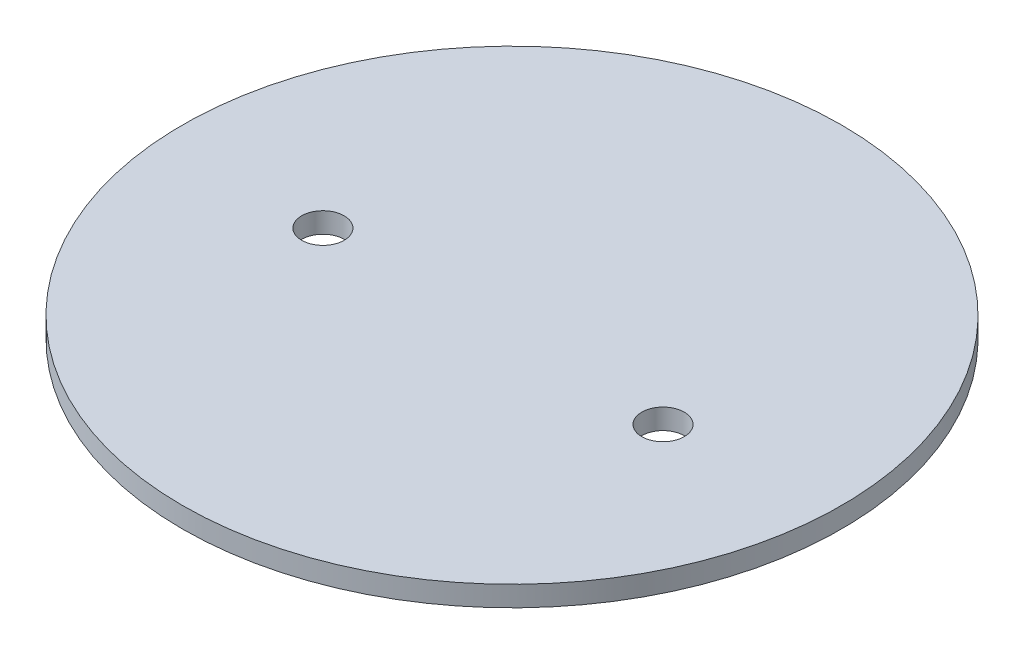
ISO-10303-21;
HEADER;
FILE_DESCRIPTION(('STEP AP214'),'2;1');
FILE_NAME('part.step','',(''),(''),'','','');
FILE_SCHEMA(('AUTOMOTIVE_DESIGN { 1 0 10303 214 1 1 1 1 }'));
ENDSEC;
DATA;
#1=APPLICATION_CONTEXT('core data for automotive mechanical design processes');
#2=APPLICATION_PROTOCOL_DEFINITION('international standard','automotive_design',2000,#1);
#3=PRODUCT_CONTEXT('',#1,'mechanical');
#4=PRODUCT('Part','Part','',(#3));
#5=PRODUCT_RELATED_PRODUCT_CATEGORY('part','',(#4));
#6=PRODUCT_DEFINITION_FORMATION('','',#4);
#7=PRODUCT_DEFINITION_CONTEXT('part definition',#1,'design');
#8=PRODUCT_DEFINITION('design','',#6,#7);
#9=PRODUCT_DEFINITION_SHAPE('','',#8);
#10=(LENGTH_UNIT() NAMED_UNIT(*) SI_UNIT(.MILLI.,.METRE.));
#11=(NAMED_UNIT(*) PLANE_ANGLE_UNIT() SI_UNIT($,.RADIAN.));
#12=(NAMED_UNIT(*) SI_UNIT($,.STERADIAN.) SOLID_ANGLE_UNIT());
#13=UNCERTAINTY_MEASURE_WITH_UNIT(LENGTH_MEASURE(1.E-05),#10,'distance_accuracy_value','');
#14=(GEOMETRIC_REPRESENTATION_CONTEXT(3) GLOBAL_UNCERTAINTY_ASSIGNED_CONTEXT((#13)) GLOBAL_UNIT_ASSIGNED_CONTEXT((#10,
#11,#12)) REPRESENTATION_CONTEXT('',''));
#15=CARTESIAN_POINT('',(0.,0.,0.));
#16=DIRECTION('',(0.,0.,1.));
#17=DIRECTION('',(1.,0.,0.));
#18=AXIS2_PLACEMENT_3D('',#15,#16,#17);
#19=CARTESIAN_POINT('',(0.,3.,0.));
#20=DIRECTION('',(0.,1.,0.));
#21=DIRECTION('',(0.,0.,1.));
#22=AXIS2_PLACEMENT_3D('',#19,#20,#21);
#23=PLANE('',#22);
#24=CARTESIAN_POINT('',(-50.,3.,5.6));
#25=DIRECTION('',(0.,1.,0.));
#26=DIRECTION('',(0.,0.,1.));
#27=AXIS2_PLACEMENT_3D('',#24,#25,#26);
#28=CIRCLE('',#27,6.25);
#29=CARTESIAN_POINT('',(-50.,3.,11.85));
#30=VERTEX_POINT('',#29);
#31=EDGE_CURVE('E41',#30,#30,#28,.T.);
#32=ORIENTED_EDGE('',*,*,#31,.F.);
#33=EDGE_LOOP('',(#32));
#34=FACE_BOUND('',#33,.T.);
#35=CARTESIAN_POINT('',(0.,3.,0.));
#36=DIRECTION('',(0.,1.,0.));
#37=DIRECTION('',(0.,0.,1.));
#38=AXIS2_PLACEMENT_3D('',#35,#36,#37);
#39=CIRCLE('',#38,96.9);
#40=CARTESIAN_POINT('',(0.,3.,96.9));
#41=VERTEX_POINT('',#40);
#42=EDGE_CURVE('E10',#41,#41,#39,.T.);
#43=ORIENTED_EDGE('',*,*,#42,.T.);
#44=EDGE_LOOP('',(#43));
#45=FACE_BOUND('',#44,.T.);
#46=CARTESIAN_POINT('',(50.,3.,5.59999999999999));
#47=DIRECTION('',(0.,1.,0.));
#48=DIRECTION('',(0.,0.,1.));
#49=AXIS2_PLACEMENT_3D('',#46,#47,#48);
#50=CIRCLE('',#49,6.25);
#51=CARTESIAN_POINT('',(50.,3.,11.85));
#52=VERTEX_POINT('',#51);
#53=EDGE_CURVE('E46',#52,#52,#50,.T.);
#54=ORIENTED_EDGE('',*,*,#53,.F.);
#55=EDGE_LOOP('',(#54));
#56=FACE_BOUND('',#55,.T.);
#57=ADVANCED_FACE('F30',(#34,#45,#56),#23,.T.);
#58=CARTESIAN_POINT('',(0.,-3.,0.));
#59=DIRECTION('',(0.,1.,0.));
#60=DIRECTION('',(0.,0.,1.));
#61=AXIS2_PLACEMENT_3D('',#58,#59,#60);
#62=PLANE('',#61);
#63=CARTESIAN_POINT('',(0.,-3.,0.));
#64=DIRECTION('',(0.,1.,0.));
#65=DIRECTION('',(0.,0.,1.));
#66=AXIS2_PLACEMENT_3D('',#63,#64,#65);
#67=CIRCLE('',#66,96.9);
#68=CARTESIAN_POINT('',(0.,-3.,96.9));
#69=VERTEX_POINT('',#68);
#70=EDGE_CURVE('E34',#69,#69,#67,.T.);
#71=ORIENTED_EDGE('',*,*,#70,.F.);
#72=EDGE_LOOP('',(#71));
#73=FACE_BOUND('',#72,.T.);
#74=CARTESIAN_POINT('',(-50.,-3.,5.6));
#75=DIRECTION('',(0.,1.,0.));
#76=DIRECTION('',(0.,0.,1.));
#77=AXIS2_PLACEMENT_3D('',#74,#75,#76);
#78=CIRCLE('',#77,6.25);
#79=CARTESIAN_POINT('',(-50.,-3.,11.85));
#80=VERTEX_POINT('',#79);
#81=EDGE_CURVE('E43',#80,#80,#78,.T.);
#82=ORIENTED_EDGE('',*,*,#81,.T.);
#83=EDGE_LOOP('',(#82));
#84=FACE_BOUND('',#83,.T.);
#85=CARTESIAN_POINT('',(50.,-3.,5.59999999999999));
#86=DIRECTION('',(0.,1.,0.));
#87=DIRECTION('',(0.,0.,1.));
#88=AXIS2_PLACEMENT_3D('',#85,#86,#87);
#89=CIRCLE('',#88,6.25);
#90=CARTESIAN_POINT('',(50.,-3.,11.85));
#91=VERTEX_POINT('',#90);
#92=EDGE_CURVE('E49',#91,#91,#89,.T.);
#93=ORIENTED_EDGE('',*,*,#92,.T.);
#94=EDGE_LOOP('',(#93));
#95=FACE_BOUND('',#94,.T.);
#96=ADVANCED_FACE('F59',(#73,#84,#95),#62,.F.);
#97=CARTESIAN_POINT('',(0.,3.,0.));
#98=DIRECTION('',(0.,-1.,0.));
#99=DIRECTION('',(0.,0.,-1.));
#100=AXIS2_PLACEMENT_3D('',#97,#98,#99);
#101=CYLINDRICAL_SURFACE('',#100,96.9);
#102=ORIENTED_EDGE('',*,*,#42,.F.);
#103=EDGE_LOOP('',(#102));
#104=FACE_BOUND('',#103,.T.);
#105=ORIENTED_EDGE('',*,*,#70,.T.);
#106=EDGE_LOOP('',(#105));
#107=FACE_BOUND('',#106,.T.);
#108=ADVANCED_FACE('F32',(#104,#107),#101,.T.);
#109=CARTESIAN_POINT('',(-50.,3.,5.6));
#110=DIRECTION('',(0.,-1.,0.));
#111=DIRECTION('',(0.,0.,-1.));
#112=AXIS2_PLACEMENT_3D('',#109,#110,#111);
#113=CYLINDRICAL_SURFACE('',#112,6.25);
#114=ORIENTED_EDGE('',*,*,#31,.T.);
#115=EDGE_LOOP('',(#114));
#116=FACE_BOUND('',#115,.T.);
#117=ORIENTED_EDGE('',*,*,#81,.F.);
#118=EDGE_LOOP('',(#117));
#119=FACE_BOUND('',#118,.T.);
#120=ADVANCED_FACE('F68',(#116,#119),#113,.F.);
#121=CARTESIAN_POINT('',(50.,3.,5.59999999999999));
#122=DIRECTION('',(0.,-1.,0.));
#123=DIRECTION('',(0.,0.,-1.));
#124=AXIS2_PLACEMENT_3D('',#121,#122,#123);
#125=CYLINDRICAL_SURFACE('',#124,6.25);
#126=ORIENTED_EDGE('',*,*,#53,.T.);
#127=EDGE_LOOP('',(#126));
#128=FACE_BOUND('',#127,.T.);
#129=ORIENTED_EDGE('',*,*,#92,.F.);
#130=EDGE_LOOP('',(#129));
#131=FACE_BOUND('',#130,.T.);
#132=ADVANCED_FACE('F55',(#128,#131),#125,.F.);
#133=CLOSED_SHELL('',(#57,#96,#108,#120,#132));
#134=MANIFOLD_SOLID_BREP('B2',#133);
#135=ADVANCED_BREP_SHAPE_REPRESENTATION('',(#18,#134),#14);
#136=SHAPE_DEFINITION_REPRESENTATION(#9,#135);
ENDSEC;
END-ISO-10303-21;
